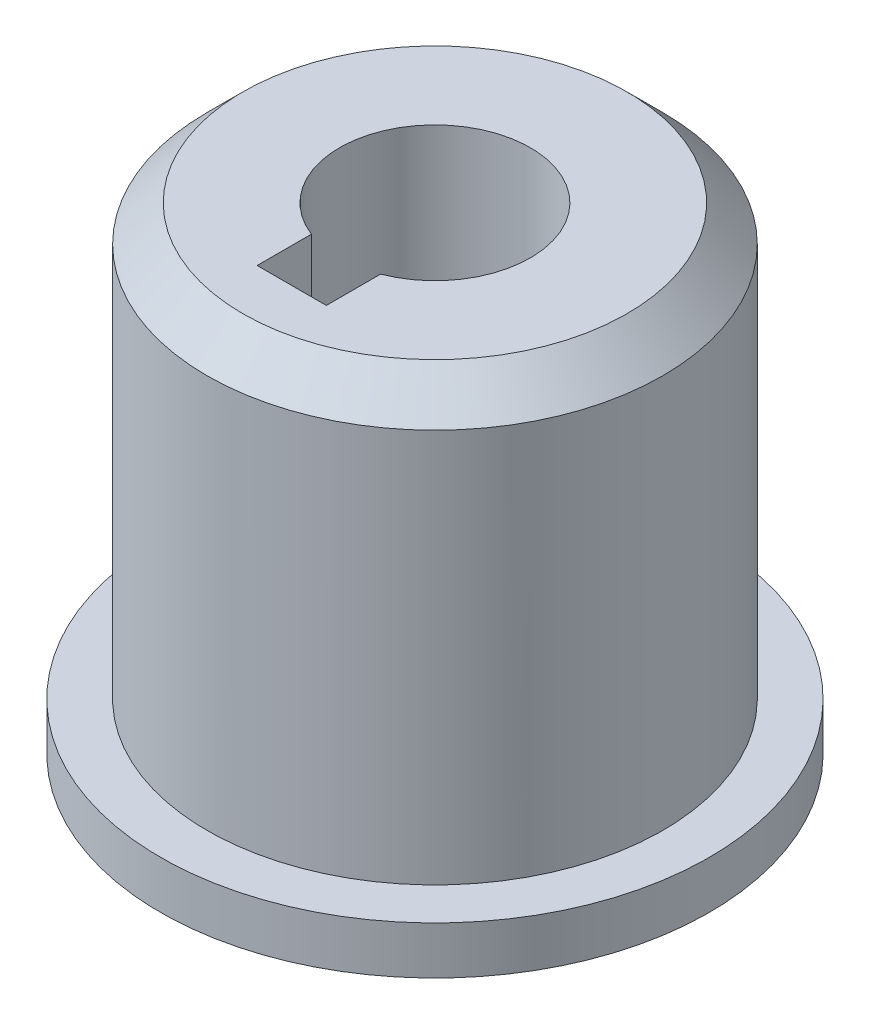
ISO-10303-21;
HEADER;
FILE_DESCRIPTION(('STEP AP214'),'2;1');
FILE_NAME('part.step','',(''),(''),'','','');
FILE_SCHEMA(('AUTOMOTIVE_DESIGN { 1 0 10303 214 1 1 1 1 }'));
ENDSEC;
DATA;
#1=APPLICATION_CONTEXT('core data for automotive mechanical design processes');
#2=APPLICATION_PROTOCOL_DEFINITION('international standard','automotive_design',2000,#1);
#3=PRODUCT_CONTEXT('',#1,'mechanical');
#4=PRODUCT('Part','Part','',(#3));
#5=PRODUCT_RELATED_PRODUCT_CATEGORY('part','',(#4));
#6=PRODUCT_DEFINITION_FORMATION('','',#4);
#7=PRODUCT_DEFINITION_CONTEXT('part definition',#1,'design');
#8=PRODUCT_DEFINITION('design','',#6,#7);
#9=PRODUCT_DEFINITION_SHAPE('','',#8);
#10=(LENGTH_UNIT() NAMED_UNIT(*) SI_UNIT(.MILLI.,.METRE.));
#11=(NAMED_UNIT(*) PLANE_ANGLE_UNIT() SI_UNIT($,.RADIAN.));
#12=(NAMED_UNIT(*) SI_UNIT($,.STERADIAN.) SOLID_ANGLE_UNIT());
#13=UNCERTAINTY_MEASURE_WITH_UNIT(LENGTH_MEASURE(1.E-05),#10,'distance_accuracy_value','');
#14=(GEOMETRIC_REPRESENTATION_CONTEXT(3) GLOBAL_UNCERTAINTY_ASSIGNED_CONTEXT((#13)) GLOBAL_UNIT_ASSIGNED_CONTEXT((#10,
#11,#12)) REPRESENTATION_CONTEXT('',''));
#15=CARTESIAN_POINT('',(0.,0.,0.));
#16=DIRECTION('',(0.,0.,1.));
#17=DIRECTION('',(1.,0.,0.));
#18=AXIS2_PLACEMENT_3D('',#15,#16,#17);
#19=CARTESIAN_POINT('',(0.,20.,0.));
#20=DIRECTION('',(0.,-1.,0.));
#21=DIRECTION('',(0.,0.,-1.));
#22=AXIS2_PLACEMENT_3D('',#19,#20,#21);
#23=CYLINDRICAL_SURFACE('',#22,9.55);
#24=CARTESIAN_POINT('',(0.,18.5,0.));
#25=DIRECTION('',(0.,1.,0.));
#26=DIRECTION('',(0.,0.,1.));
#27=AXIS2_PLACEMENT_3D('',#24,#25,#26);
#28=CIRCLE('',#27,9.55);
#29=CARTESIAN_POINT('',(0.,18.5,9.55));
#30=VERTEX_POINT('',#29);
#31=EDGE_CURVE('E55',#30,#30,#28,.F.);
#32=ORIENTED_EDGE('',*,*,#31,.T.);
#33=EDGE_LOOP('',(#32));
#34=FACE_BOUND('',#33,.T.);
#35=CARTESIAN_POINT('',(0.,2.,0.));
#36=DIRECTION('',(0.,-1.,0.));
#37=DIRECTION('',(0.,0.,-1.));
#38=AXIS2_PLACEMENT_3D('',#35,#36,#37);
#39=CIRCLE('',#38,9.55);
#40=CARTESIAN_POINT('',(0.,2.,-9.55));
#41=VERTEX_POINT('',#40);
#42=EDGE_CURVE('E11',#41,#41,#39,.T.);
#43=ORIENTED_EDGE('',*,*,#42,.F.);
#44=EDGE_LOOP('',(#43));
#45=FACE_BOUND('',#44,.T.);
#46=ADVANCED_FACE('F45',(#34,#45),#23,.T.);
#47=CARTESIAN_POINT('',(0.,20.,0.));
#48=DIRECTION('',(0.,1.,0.));
#49=DIRECTION('',(0.,0.,1.));
#50=AXIS2_PLACEMENT_3D('',#47,#48,#49);
#51=PLANE('',#50);
#52=CARTESIAN_POINT('',(0.,20.,0.));
#53=DIRECTION('',(0.,1.,0.));
#54=DIRECTION('',(0.,0.,1.));
#55=AXIS2_PLACEMENT_3D('',#52,#53,#54);
#56=CIRCLE('',#55,8.05);
#57=CARTESIAN_POINT('',(0.,20.,8.05));
#58=VERTEX_POINT('',#57);
#59=EDGE_CURVE('E106',#58,#58,#56,.T.);
#60=ORIENTED_EDGE('',*,*,#59,.T.);
#61=EDGE_LOOP('',(#60));
#62=FACE_BOUND('',#61,.T.);
#63=DIRECTION('',(1.,0.,0.));
#64=VECTOR('',#63,1.);
#65=CARTESIAN_POINT('',(-1.45,20.,6.));
#66=LINE('',#65,#64);
#67=CARTESIAN_POINT('',(-1.45,20.,6.));
#68=VERTEX_POINT('',#67);
#69=CARTESIAN_POINT('',(1.45,20.,6.));
#70=VERTEX_POINT('',#69);
#71=EDGE_CURVE('E97',#68,#70,#66,.T.);
#72=ORIENTED_EDGE('',*,*,#71,.F.);
#73=DIRECTION('',(0.,0.,1.));
#74=VECTOR('',#73,1.);
#75=CARTESIAN_POINT('',(-1.45,20.,6.));
#76=LINE('',#75,#74);
#77=CARTESIAN_POINT('',(-1.45,20.,3.72793508527174));
#78=VERTEX_POINT('',#77);
#79=EDGE_CURVE('E88',#78,#68,#76,.T.);
#80=ORIENTED_EDGE('',*,*,#79,.F.);
#81=CARTESIAN_POINT('',(0.,20.,0.));
#82=DIRECTION('',(0.,1.,0.));
#83=DIRECTION('',(0.,0.,1.));
#84=AXIS2_PLACEMENT_3D('',#81,#82,#83);
#85=CIRCLE('',#84,4.);
#86=CARTESIAN_POINT('',(1.45,20.,3.72793508527174));
#87=VERTEX_POINT('',#86);
#88=EDGE_CURVE('E115',#87,#78,#85,.T.);
#89=ORIENTED_EDGE('',*,*,#88,.F.);
#90=DIRECTION('',(0.,0.,-1.));
#91=VECTOR('',#90,1.);
#92=CARTESIAN_POINT('',(1.45,20.,6.));
#93=LINE('',#92,#91);
#94=EDGE_CURVE('E111',#70,#87,#93,.T.);
#95=ORIENTED_EDGE('',*,*,#94,.F.);
#96=EDGE_LOOP('',(#72,#80,#89,#95));
#97=FACE_BOUND('',#96,.T.);
#98=ADVANCED_FACE('F110',(#62,#97),#51,.T.);
#99=CARTESIAN_POINT('',(0.,0.,0.));
#100=DIRECTION('',(0.,1.,0.));
#101=DIRECTION('',(0.,0.,1.));
#102=AXIS2_PLACEMENT_3D('',#99,#100,#101);
#103=PLANE('',#102);
#104=DIRECTION('',(0.,0.,1.));
#105=VECTOR('',#104,1.);
#106=CARTESIAN_POINT('',(-1.45,0.,6.));
#107=LINE('',#106,#105);
#108=CARTESIAN_POINT('',(-1.45,0.,3.72793508527174));
#109=VERTEX_POINT('',#108);
#110=CARTESIAN_POINT('',(-1.45,0.,6.));
#111=VERTEX_POINT('',#110);
#112=EDGE_CURVE('E70',#109,#111,#107,.T.);
#113=ORIENTED_EDGE('',*,*,#112,.T.);
#114=DIRECTION('',(1.,0.,0.));
#115=VECTOR('',#114,1.);
#116=CARTESIAN_POINT('',(-1.45,0.,6.));
#117=LINE('',#116,#115);
#118=CARTESIAN_POINT('',(1.45,0.,6.));
#119=VERTEX_POINT('',#118);
#120=EDGE_CURVE('E104',#111,#119,#117,.T.);
#121=ORIENTED_EDGE('',*,*,#120,.T.);
#122=DIRECTION('',(0.,0.,-1.));
#123=VECTOR('',#122,1.);
#124=CARTESIAN_POINT('',(1.45,0.,6.));
#125=LINE('',#124,#123);
#126=CARTESIAN_POINT('',(1.45,0.,3.72793508527174));
#127=VERTEX_POINT('',#126);
#128=EDGE_CURVE('E126',#119,#127,#125,.T.);
#129=ORIENTED_EDGE('',*,*,#128,.T.);
#130=CARTESIAN_POINT('',(0.,0.,0.));
#131=DIRECTION('',(0.,1.,0.));
#132=DIRECTION('',(0.,0.,1.));
#133=AXIS2_PLACEMENT_3D('',#130,#131,#132);
#134=CIRCLE('',#133,4.);
#135=EDGE_CURVE('E98',#127,#109,#134,.T.);
#136=ORIENTED_EDGE('',*,*,#135,.T.);
#137=EDGE_LOOP('',(#113,#121,#129,#136));
#138=FACE_BOUND('',#137,.T.);
#139=CARTESIAN_POINT('',(0.,0.,0.));
#140=DIRECTION('',(0.,-1.,0.));
#141=DIRECTION('',(0.,0.,-1.));
#142=AXIS2_PLACEMENT_3D('',#139,#140,#141);
#143=CIRCLE('',#142,11.5);
#144=CARTESIAN_POINT('',(0.,0.,-11.5));
#145=VERTEX_POINT('',#144);
#146=EDGE_CURVE('E186',#145,#145,#143,.T.);
#147=ORIENTED_EDGE('',*,*,#146,.T.);
#148=EDGE_LOOP('',(#147));
#149=FACE_BOUND('',#148,.T.);
#150=ADVANCED_FACE('F154',(#138,#149),#103,.F.);
#151=CARTESIAN_POINT('',(-1.45,20.,6.));
#152=DIRECTION('',(1.,0.,0.));
#153=DIRECTION('',(0.,0.,-1.));
#154=AXIS2_PLACEMENT_3D('',#151,#152,#153);
#155=PLANE('',#154);
#156=ORIENTED_EDGE('',*,*,#112,.F.);
#157=DIRECTION('',(0.,-1.,0.));
#158=VECTOR('',#157,1.);
#159=CARTESIAN_POINT('',(-1.45,20.,3.72793508527174));
#160=LINE('',#159,#158);
#161=EDGE_CURVE('E92',#78,#109,#160,.T.);
#162=ORIENTED_EDGE('',*,*,#161,.F.);
#163=ORIENTED_EDGE('',*,*,#79,.T.);
#164=DIRECTION('',(0.,-1.,0.));
#165=VECTOR('',#164,1.);
#166=CARTESIAN_POINT('',(-1.45,20.,6.));
#167=LINE('',#166,#165);
#168=EDGE_CURVE('E91',#68,#111,#167,.T.);
#169=ORIENTED_EDGE('',*,*,#168,.T.);
#170=EDGE_LOOP('',(#156,#162,#163,#169));
#171=FACE_BOUND('',#170,.T.);
#172=ADVANCED_FACE('F90',(#171),#155,.T.);
#173=CARTESIAN_POINT('',(-1.45,20.,6.));
#174=DIRECTION('',(0.,0.,-1.));
#175=DIRECTION('',(-1.,0.,0.));
#176=AXIS2_PLACEMENT_3D('',#173,#174,#175);
#177=PLANE('',#176);
#178=ORIENTED_EDGE('',*,*,#120,.F.);
#179=ORIENTED_EDGE('',*,*,#168,.F.);
#180=ORIENTED_EDGE('',*,*,#71,.T.);
#181=DIRECTION('',(0.,-1.,0.));
#182=VECTOR('',#181,1.);
#183=CARTESIAN_POINT('',(1.45,20.,6.));
#184=LINE('',#183,#182);
#185=EDGE_CURVE('E107',#70,#119,#184,.T.);
#186=ORIENTED_EDGE('',*,*,#185,.T.);
#187=EDGE_LOOP('',(#178,#179,#180,#186));
#188=FACE_BOUND('',#187,.T.);
#189=ADVANCED_FACE('F101',(#188),#177,.T.);
#190=CARTESIAN_POINT('',(1.45,20.,6.));
#191=DIRECTION('',(-1.,0.,0.));
#192=DIRECTION('',(0.,0.,1.));
#193=AXIS2_PLACEMENT_3D('',#190,#191,#192);
#194=PLANE('',#193);
#195=ORIENTED_EDGE('',*,*,#128,.F.);
#196=ORIENTED_EDGE('',*,*,#185,.F.);
#197=ORIENTED_EDGE('',*,*,#94,.T.);
#198=DIRECTION('',(0.,-1.,0.));
#199=VECTOR('',#198,1.);
#200=CARTESIAN_POINT('',(1.45,20.,3.72793508527174));
#201=LINE('',#200,#199);
#202=EDGE_CURVE('E62',#87,#127,#201,.T.);
#203=ORIENTED_EDGE('',*,*,#202,.T.);
#204=EDGE_LOOP('',(#195,#196,#197,#203));
#205=FACE_BOUND('',#204,.T.);
#206=ADVANCED_FACE('F167',(#205),#194,.T.);
#207=CARTESIAN_POINT('',(0.,20.,0.));
#208=DIRECTION('',(0.,-1.,0.));
#209=DIRECTION('',(0.,0.,-1.));
#210=AXIS2_PLACEMENT_3D('',#207,#208,#209);
#211=CYLINDRICAL_SURFACE('',#210,4.);
#212=ORIENTED_EDGE('',*,*,#135,.F.);
#213=ORIENTED_EDGE('',*,*,#202,.F.);
#214=ORIENTED_EDGE('',*,*,#88,.T.);
#215=ORIENTED_EDGE('',*,*,#161,.T.);
#216=EDGE_LOOP('',(#212,#213,#214,#215));
#217=FACE_BOUND('',#216,.T.);
#218=ADVANCED_FACE('F150',(#217),#211,.F.);
#219=CARTESIAN_POINT('',(0.,20.,0.));
#220=DIRECTION('',(0.,-1.,0.));
#221=DIRECTION('',(0.,0.,-1.));
#222=AXIS2_PLACEMENT_3D('',#219,#220,#221);
#223=CONICAL_SURFACE('',#222,8.05,0.785398163397448);
#224=ORIENTED_EDGE('',*,*,#31,.F.);
#225=EDGE_LOOP('',(#224));
#226=FACE_BOUND('',#225,.T.);
#227=ORIENTED_EDGE('',*,*,#59,.F.);
#228=EDGE_LOOP('',(#227));
#229=FACE_BOUND('',#228,.T.);
#230=ADVANCED_FACE('F48',(#226,#229),#223,.T.);
#231=CARTESIAN_POINT('',(0.,2.,0.));
#232=DIRECTION('',(0.,-1.,0.));
#233=DIRECTION('',(0.,0.,-1.));
#234=AXIS2_PLACEMENT_3D('',#231,#232,#233);
#235=CYLINDRICAL_SURFACE('',#234,11.5);
#236=CARTESIAN_POINT('',(0.,2.,0.));
#237=DIRECTION('',(0.,-1.,0.));
#238=DIRECTION('',(0.,0.,-1.));
#239=AXIS2_PLACEMENT_3D('',#236,#237,#238);
#240=CIRCLE('',#239,11.5);
#241=CARTESIAN_POINT('',(0.,2.,-11.5));
#242=VERTEX_POINT('',#241);
#243=EDGE_CURVE('E123',#242,#242,#240,.T.);
#244=ORIENTED_EDGE('',*,*,#243,.T.);
#245=EDGE_LOOP('',(#244));
#246=FACE_BOUND('',#245,.T.);
#247=ORIENTED_EDGE('',*,*,#146,.F.);
#248=EDGE_LOOP('',(#247));
#249=FACE_BOUND('',#248,.T.);
#250=ADVANCED_FACE('F149',(#246,#249),#235,.T.);
#251=CARTESIAN_POINT('',(0.,2.,0.));
#252=DIRECTION('',(0.,-1.,0.));
#253=DIRECTION('',(0.,0.,-1.));
#254=AXIS2_PLACEMENT_3D('',#251,#252,#253);
#255=PLANE('',#254);
#256=ORIENTED_EDGE('',*,*,#42,.T.);
#257=EDGE_LOOP('',(#256));
#258=FACE_BOUND('',#257,.T.);
#259=ORIENTED_EDGE('',*,*,#243,.F.);
#260=EDGE_LOOP('',(#259));
#261=FACE_BOUND('',#260,.T.);
#262=ADVANCED_FACE('F175',(#258,#261),#255,.F.);
#263=CLOSED_SHELL('',(#46,#98,#150,#172,#189,#206,#218,#230,#250,#262));
#264=MANIFOLD_SOLID_BREP('B2',#263);
#265=ADVANCED_BREP_SHAPE_REPRESENTATION('',(#18,#264),#14);
#266=SHAPE_DEFINITION_REPRESENTATION(#9,#265);
ENDSEC;
END-ISO-10303-21;
